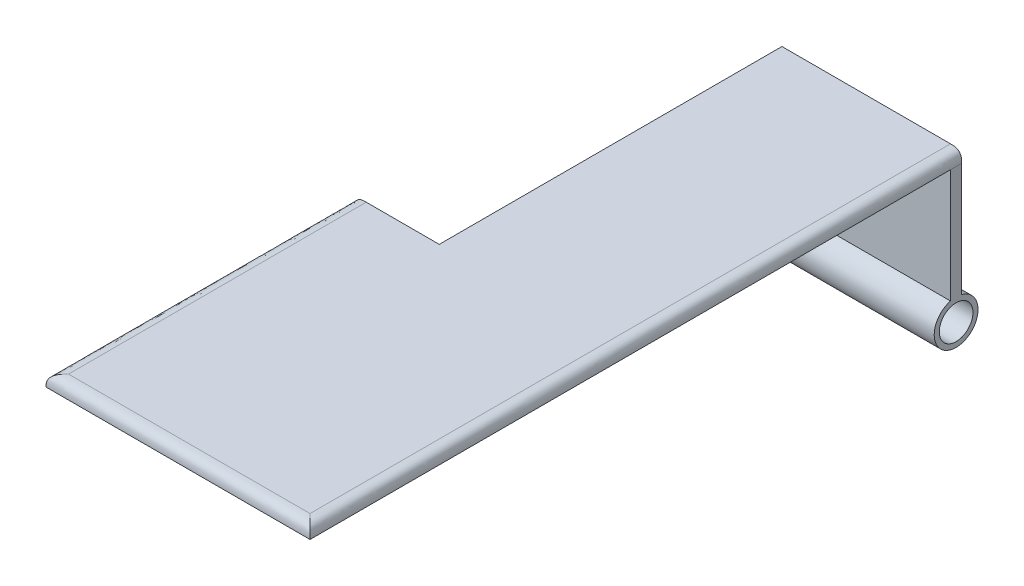
ISO-10303-21;
HEADER;
FILE_DESCRIPTION(('STEP AP214'),'2;1');
FILE_NAME('part.step','',(''),(''),'','','');
FILE_SCHEMA(('AUTOMOTIVE_DESIGN { 1 0 10303 214 1 1 1 1 }'));
ENDSEC;
DATA;
#1=APPLICATION_CONTEXT('core data for automotive mechanical design processes');
#2=APPLICATION_PROTOCOL_DEFINITION('international standard','automotive_design',2000,#1);
#3=PRODUCT_CONTEXT('',#1,'mechanical');
#4=PRODUCT('Part','Part','',(#3));
#5=PRODUCT_RELATED_PRODUCT_CATEGORY('part','',(#4));
#6=PRODUCT_DEFINITION_FORMATION('','',#4);
#7=PRODUCT_DEFINITION_CONTEXT('part definition',#1,'design');
#8=PRODUCT_DEFINITION('design','',#6,#7);
#9=PRODUCT_DEFINITION_SHAPE('','',#8);
#10=(LENGTH_UNIT() NAMED_UNIT(*) SI_UNIT(.MILLI.,.METRE.));
#11=(NAMED_UNIT(*) PLANE_ANGLE_UNIT() SI_UNIT($,.RADIAN.));
#12=(NAMED_UNIT(*) SI_UNIT($,.STERADIAN.) SOLID_ANGLE_UNIT());
#13=UNCERTAINTY_MEASURE_WITH_UNIT(LENGTH_MEASURE(1.E-05),#10,'distance_accuracy_value','');
#14=(GEOMETRIC_REPRESENTATION_CONTEXT(3) GLOBAL_UNCERTAINTY_ASSIGNED_CONTEXT((#13)) GLOBAL_UNIT_ASSIGNED_CONTEXT((#10,
#11,#12)) REPRESENTATION_CONTEXT('',''));
#15=CARTESIAN_POINT('',(0.,0.,0.));
#16=DIRECTION('',(0.,0.,1.));
#17=DIRECTION('',(1.,0.,0.));
#18=AXIS2_PLACEMENT_3D('',#15,#16,#17);
#19=CARTESIAN_POINT('',(-70.6908921558042,0.,0.500534490034143));
#20=DIRECTION('',(0.,0.,-1.));
#21=DIRECTION('',(1.,0.,0.));
#22=AXIS2_PLACEMENT_3D('',#19,#20,#21);
#23=PLANE('',#22);
#24=DIRECTION('',(0.,-1.,0.));
#25=VECTOR('',#24,1.);
#26=CARTESIAN_POINT('',(-70.6908921558042,0.,0.500534490034143));
#27=LINE('',#26,#25);
#28=CARTESIAN_POINT('',(-70.6908921558042,12.,0.500534490034143));
#29=VERTEX_POINT('',#28);
#30=CARTESIAN_POINT('',(-70.6908921558042,1.88466581236204,0.500534490034143));
#31=VERTEX_POINT('',#30);
#32=EDGE_CURVE('E294',#29,#31,#27,.T.);
#33=ORIENTED_EDGE('',*,*,#32,.T.);
#34=DIRECTION('',(1.,0.,0.));
#35=VECTOR('',#34,1.);
#36=CARTESIAN_POINT('',(-70.6908921558042,1.88466581236204,0.500534490034143));
#37=LINE('',#36,#35);
#38=CARTESIAN_POINT('',(-54.6908921558042,1.88466581236204,0.500534490034143));
#39=VERTEX_POINT('',#38);
#40=EDGE_CURVE('E284',#31,#39,#37,.T.);
#41=ORIENTED_EDGE('',*,*,#40,.T.);
#42=DIRECTION('',(0.,-1.,0.));
#43=VECTOR('',#42,1.);
#44=CARTESIAN_POINT('',(-54.6908921558042,0.,0.500534490034143));
#45=LINE('',#44,#43);
#46=CARTESIAN_POINT('',(-54.6908921558042,12.,0.500534490034143));
#47=VERTEX_POINT('',#46);
#48=EDGE_CURVE('E304',#47,#39,#45,.T.);
#49=ORIENTED_EDGE('',*,*,#48,.F.);
#50=DIRECTION('',(1.,0.,0.));
#51=VECTOR('',#50,1.);
#52=CARTESIAN_POINT('',(-70.6908921558042,12.,0.500534490034143));
#53=LINE('',#52,#51);
#54=EDGE_CURVE('E134',#29,#47,#53,.T.);
#55=ORIENTED_EDGE('',*,*,#54,.F.);
#56=EDGE_LOOP('',(#33,#41,#49,#55));
#57=FACE_BOUND('',#56,.T.);
#58=ADVANCED_FACE('F32',(#57),#23,.F.);
#59=CARTESIAN_POINT('',(-70.6908921558042,0.,0.));
#60=DIRECTION('',(1.,0.,0.));
#61=DIRECTION('',(0.,0.,1.));
#62=AXIS2_PLACEMENT_3D('',#59,#60,#61);
#63=CYLINDRICAL_SURFACE('',#62,1.95);
#64=CARTESIAN_POINT('',(-54.6908921558042,0.,0.));
#65=DIRECTION('',(1.,0.,0.));
#66=DIRECTION('',(0.,0.,-1.));
#67=AXIS2_PLACEMENT_3D('',#64,#65,#66);
#68=CIRCLE('',#67,1.95);
#69=CARTESIAN_POINT('',(-54.6908921558042,1.88494939039608,-0.499465509965857));
#70=VERTEX_POINT('',#69);
#71=EDGE_CURVE('E270',#39,#70,#68,.T.);
#72=ORIENTED_EDGE('',*,*,#71,.F.);
#73=ORIENTED_EDGE('',*,*,#40,.F.);
#74=CARTESIAN_POINT('',(-70.6908921558042,0.,0.));
#75=DIRECTION('',(1.,0.,0.));
#76=DIRECTION('',(0.,0.,-1.));
#77=AXIS2_PLACEMENT_3D('',#74,#75,#76);
#78=CIRCLE('',#77,1.95);
#79=CARTESIAN_POINT('',(-70.6908921558042,1.88494939039608,-0.499465509965857));
#80=VERTEX_POINT('',#79);
#81=EDGE_CURVE('E297',#31,#80,#78,.T.);
#82=ORIENTED_EDGE('',*,*,#81,.T.);
#83=DIRECTION('',(1.,0.,0.));
#84=VECTOR('',#83,1.);
#85=CARTESIAN_POINT('',(-70.6908921558042,1.88494939039608,-0.499465509965857));
#86=LINE('',#85,#84);
#87=EDGE_CURVE('E278',#80,#70,#86,.T.);
#88=ORIENTED_EDGE('',*,*,#87,.T.);
#89=EDGE_LOOP('',(#72,#73,#82,#88));
#90=FACE_BOUND('',#89,.T.);
#91=ADVANCED_FACE('F336',(#90),#63,.T.);
#92=CARTESIAN_POINT('',(-70.6908921558042,0.,-0.499465509965857));
#93=DIRECTION('',(0.,0.,-1.));
#94=DIRECTION('',(1.,0.,0.));
#95=AXIS2_PLACEMENT_3D('',#92,#93,#94);
#96=PLANE('',#95);
#97=DIRECTION('',(0.,-1.,0.));
#98=VECTOR('',#97,1.);
#99=CARTESIAN_POINT('',(-54.6908921558042,0.,-0.499465509965857));
#100=LINE('',#99,#98);
#101=CARTESIAN_POINT('',(-54.6908921558042,12.,-0.499465509965857));
#102=VERTEX_POINT('',#101);
#103=EDGE_CURVE('E266',#102,#70,#100,.T.);
#104=ORIENTED_EDGE('',*,*,#103,.T.);
#105=ORIENTED_EDGE('',*,*,#87,.F.);
#106=DIRECTION('',(0.,-1.,0.));
#107=VECTOR('',#106,1.);
#108=CARTESIAN_POINT('',(-70.6908921558042,0.,-0.499465509965857));
#109=LINE('',#108,#107);
#110=CARTESIAN_POINT('',(-70.6908921558042,13.,-0.499465509965857));
#111=VERTEX_POINT('',#110);
#112=EDGE_CURVE('E300',#111,#80,#109,.T.);
#113=ORIENTED_EDGE('',*,*,#112,.F.);
#114=DIRECTION('',(1.,0.,0.));
#115=VECTOR('',#114,1.);
#116=CARTESIAN_POINT('',(-70.6908921558042,13.,-0.499465509965857));
#117=LINE('',#116,#115);
#118=CARTESIAN_POINT('',(-55.6908921558042,13.,-0.499465509965857));
#119=VERTEX_POINT('',#118);
#120=EDGE_CURVE('E281',#111,#119,#117,.T.);
#121=ORIENTED_EDGE('',*,*,#120,.T.);
#122=CARTESIAN_POINT('',(-54.6908921558042,12.,-0.499465509967068));
#123=CARTESIAN_POINT('',(-54.6908921558042,12.1681980515339,-0.499465509967068));
#124=CARTESIAN_POINT('',(-54.6908921558042,12.3363961030679,-0.499465509967068));
#125=CARTESIAN_POINT('',(-54.7625840756403,12.7071067811865,-0.499465509963932));
#126=CARTESIAN_POINT('',(-54.9837853746176,12.9283080801639,-0.499465509963932));
#127=CARTESIAN_POINT('',(-55.3544960527363,13.,-0.499465509967068));
#128=CARTESIAN_POINT('',(-55.5226941042703,13.,-0.499465509967068));
#129=CARTESIAN_POINT('',(-55.6908921558042,13.,-0.499465509967068));
#130=B_SPLINE_CURVE_WITH_KNOTS('',5,(#122,#123,#124,#125,#126,#127,#128,#129),.UNSPECIFIED.,.F.,
.F.,(6,2,6),(0.,0.5,1.),.UNSPECIFIED.);
#131=EDGE_CURVE('E11',#102,#119,#130,.T.);
#132=ORIENTED_EDGE('',*,*,#131,.F.);
#133=EDGE_LOOP('',(#104,#105,#113,#121,#132));
#134=FACE_BOUND('',#133,.T.);
#135=ADVANCED_FACE('F325',(#134),#96,.T.);
#136=CARTESIAN_POINT('',(-70.6908921558042,0.,0.));
#137=DIRECTION('',(1.,0.,0.));
#138=DIRECTION('',(0.,0.,1.));
#139=AXIS2_PLACEMENT_3D('',#136,#137,#138);
#140=CYLINDRICAL_SURFACE('',#139,1.5);
#141=CARTESIAN_POINT('',(-70.6908921558042,0.,0.));
#142=DIRECTION('',(1.,0.,0.));
#143=DIRECTION('',(0.,0.,-1.));
#144=AXIS2_PLACEMENT_3D('',#141,#142,#143);
#145=CIRCLE('',#144,1.5);
#146=CARTESIAN_POINT('',(-70.6908921558042,0.,-1.5));
#147=VERTEX_POINT('',#146);
#148=EDGE_CURVE('E269',#147,#147,#145,.T.);
#149=ORIENTED_EDGE('',*,*,#148,.F.);
#150=EDGE_LOOP('',(#149));
#151=FACE_BOUND('',#150,.T.);
#152=CARTESIAN_POINT('',(-54.6908921558042,0.,0.));
#153=DIRECTION('',(1.,0.,0.));
#154=DIRECTION('',(0.,0.,-1.));
#155=AXIS2_PLACEMENT_3D('',#152,#153,#154);
#156=CIRCLE('',#155,1.5);
#157=CARTESIAN_POINT('',(-54.6908921558042,0.,-1.5));
#158=VERTEX_POINT('',#157);
#159=EDGE_CURVE('E302',#158,#158,#156,.T.);
#160=ORIENTED_EDGE('',*,*,#159,.T.);
#161=EDGE_LOOP('',(#160));
#162=FACE_BOUND('',#161,.T.);
#163=ADVANCED_FACE('F335',(#151,#162),#140,.F.);
#164=CARTESIAN_POINT('',(-70.6908921558042,13.,0.));
#165=DIRECTION('',(0.,1.,0.));
#166=DIRECTION('',(0.,0.,1.));
#167=AXIS2_PLACEMENT_3D('',#164,#165,#166);
#168=PLANE('',#167);
#169=CARTESIAN_POINT('',(-53.5158921558042,13.,56.5));
#170=CARTESIAN_POINT('',(-53.9992254891375,13.,56.5));
#171=CARTESIAN_POINT('',(-57.1131143780264,13.,56.5));
#172=CARTESIAN_POINT('',(-62.6158921558047,13.,56.5000000000001));
#173=CARTESIAN_POINT('',(-70.2658921557703,13.0000000000001,56.5000000000001));
#174=CARTESIAN_POINT('',(-75.7686699335866,13.,56.5));
#175=CARTESIAN_POINT('',(-78.88255882247,13.,56.5));
#176=CARTESIAN_POINT('',(-79.3658921558042,13.,56.5));
#177=B_SPLINE_CURVE_WITH_KNOTS('',3,(#169,#170,#171,#172,#173,#174,#175,#176),.UNSPECIFIED.,.F.,
.F.,(4,1,1,1,1,4),(-0.017175,-0.015725,-0.00783333333333333,-0.000666666666666663,
0.00722500000000001,0.00867500000000001),.UNSPECIFIED.);
#178=CARTESIAN_POINT('',(-55.6908921558042,13.,56.5000000000002));
#179=VERTEX_POINT('',#178);
#180=CARTESIAN_POINT('',(-77.1908921558042,13.,56.5));
#181=VERTEX_POINT('',#180);
#182=EDGE_CURVE('E242',#179,#181,#177,.T.);
#183=ORIENTED_EDGE('',*,*,#182,.F.);
#184=CARTESIAN_POINT('',(-55.6908921558042,13.,-3.39943878546415));
#185=CARTESIAN_POINT('',(-55.6908921558042,13.,9.91154761130566));
#186=CARTESIAN_POINT('',(-55.6908921558042,12.9999999999998,30.3113575704043));
#187=CARTESIAN_POINT('',(-55.6908921558042,13.,51.5778282573921));
#188=CARTESIAN_POINT('',(-55.6908921558042,13.,59.5333125476098));
#189=CARTESIAN_POINT('',(-55.6908921558042,13.,60.3999732754983));
#190=B_SPLINE_CURVE_WITH_KNOTS('',3,(#184,#185,#186,#187,#188,#189),.UNSPECIFIED.,.F.,.F.,(4,1,
1,4),(-0.00339943878546415,0.0365335204048453,0.0577999910918328,0.0603999732754983),.UNSPECIFIED.);
#191=EDGE_CURVE('E112',#119,#179,#190,.T.);
#192=ORIENTED_EDGE('',*,*,#191,.F.);
#193=ORIENTED_EDGE('',*,*,#120,.F.);
#194=DIRECTION('',(0.,0.,-1.));
#195=VECTOR('',#194,1.);
#196=CARTESIAN_POINT('',(-70.6908921558042,13.,0.));
#197=LINE('',#196,#195);
#198=CARTESIAN_POINT('',(-70.6908921558042,13.,30.0005344900341));
#199=VERTEX_POINT('',#198);
#200=EDGE_CURVE('E283',#199,#111,#197,.T.);
#201=ORIENTED_EDGE('',*,*,#200,.F.);
#202=DIRECTION('',(1.,0.,0.));
#203=VECTOR('',#202,1.);
#204=CARTESIAN_POINT('',(-70.6908921558042,13.,30.0005344900341));
#205=LINE('',#204,#203);
#206=CARTESIAN_POINT('',(-77.1908921558042,13.,30.0005344900341));
#207=VERTEX_POINT('',#206);
#208=EDGE_CURVE('E118',#207,#199,#205,.T.);
#209=ORIENTED_EDGE('',*,*,#208,.F.);
#210=CARTESIAN_POINT('',(-77.1908921558042,13.,58.8749732754983));
#211=CARTESIAN_POINT('',(-77.1908921558042,13.,58.3472014364987));
#212=CARTESIAN_POINT('',(-77.1908921558042,13.,54.4583838129476));
#213=CARTESIAN_POINT('',(-77.1908921558044,13.0000000000001,44.3752464592939));
#214=CARTESIAN_POINT('',(-77.1908921558042,13.,34.819880944639));
#215=CARTESIAN_POINT('',(-77.1908921558042,13.,28.6255612145358));
#216=B_SPLINE_CURVE_WITH_KNOTS('',3,(#210,#211,#212,#213,#214,#215),.UNSPECIFIED.,.F.,.F.,(4,1,
1,4),(-0.0588749732754983,-0.0572916577584994,-0.0472085204048453,-0.0286255612145358),.UNSPECIFIED.);
#217=EDGE_CURVE('E377',#181,#207,#216,.T.);
#218=ORIENTED_EDGE('',*,*,#217,.F.);
#219=EDGE_LOOP('',(#183,#192,#193,#201,#209,#218));
#220=FACE_BOUND('',#219,.T.);
#221=ADVANCED_FACE('F337',(#220),#168,.T.);
#222=CARTESIAN_POINT('',(-70.6908921558042,0.,0.));
#223=DIRECTION('',(-1.,0.,0.));
#224=DIRECTION('',(0.,0.,-1.));
#225=AXIS2_PLACEMENT_3D('',#222,#223,#224);
#226=PLANE('',#225);
#227=ORIENTED_EDGE('',*,*,#112,.T.);
#228=ORIENTED_EDGE('',*,*,#81,.F.);
#229=ORIENTED_EDGE('',*,*,#32,.F.);
#230=DIRECTION('',(0.,0.,-1.));
#231=VECTOR('',#230,1.);
#232=CARTESIAN_POINT('',(-70.6908921558042,12.,0.000534490034142989));
#233=LINE('',#232,#231);
#234=CARTESIAN_POINT('',(-70.6908921558042,12.,30.0005344900341));
#235=VERTEX_POINT('',#234);
#236=EDGE_CURVE('E254',#235,#29,#233,.T.);
#237=ORIENTED_EDGE('',*,*,#236,.F.);
#238=DIRECTION('',(0.,1.,0.));
#239=VECTOR('',#238,1.);
#240=CARTESIAN_POINT('',(-70.6908921558042,12.,30.0005344900341));
#241=LINE('',#240,#239);
#242=EDGE_CURVE('E257',#235,#199,#241,.T.);
#243=ORIENTED_EDGE('',*,*,#242,.T.);
#244=ORIENTED_EDGE('',*,*,#200,.T.);
#245=EDGE_LOOP('',(#227,#228,#229,#237,#243,#244));
#246=FACE_BOUND('',#245,.T.);
#247=ORIENTED_EDGE('',*,*,#148,.T.);
#248=EDGE_LOOP('',(#247));
#249=FACE_BOUND('',#248,.T.);
#250=ADVANCED_FACE('F351',(#246,#249),#226,.T.);
#251=CARTESIAN_POINT('',(-54.6908921558042,0.,0.));
#252=DIRECTION('',(-1.,0.,0.));
#253=DIRECTION('',(0.,0.,-1.));
#254=AXIS2_PLACEMENT_3D('',#251,#252,#253);
#255=PLANE('',#254);
#256=ORIENTED_EDGE('',*,*,#48,.T.);
#257=ORIENTED_EDGE('',*,*,#71,.T.);
#258=ORIENTED_EDGE('',*,*,#103,.F.);
#259=CARTESIAN_POINT('',(-54.6908921558042,12.,60.3999732754983));
#260=CARTESIAN_POINT('',(-54.6908921558042,12.,59.5333125476098));
#261=CARTESIAN_POINT('',(-54.6908921558042,12.,51.5778282573921));
#262=CARTESIAN_POINT('',(-54.6908921558042,11.9999999999998,30.3113575704043));
#263=CARTESIAN_POINT('',(-54.6908921558042,12.,9.91154761130566));
#264=CARTESIAN_POINT('',(-54.6908921558042,12.,-3.39943878546415));
#265=B_SPLINE_CURVE_WITH_KNOTS('',3,(#259,#260,#261,#262,#263,#264),.UNSPECIFIED.,.F.,.F.,(4,1,
1,4),(-0.00339943878546415,-0.000799456601798622,0.0204670140851889,0.0603999732754983),.UNSPECIFIED.);
#266=EDGE_CURVE('E46',#47,#102,#265,.T.);
#267=ORIENTED_EDGE('',*,*,#266,.F.);
#268=EDGE_LOOP('',(#256,#257,#258,#267));
#269=FACE_BOUND('',#268,.T.);
#270=ORIENTED_EDGE('',*,*,#159,.F.);
#271=EDGE_LOOP('',(#270));
#272=FACE_BOUND('',#271,.T.);
#273=ADVANCED_FACE('F149',(#269,#272),#255,.F.);
#274=CARTESIAN_POINT('',(-54.6908921558042,12.,0.));
#275=DIRECTION('',(0.,-1.,0.));
#276=DIRECTION('',(0.,0.,-1.));
#277=AXIS2_PLACEMENT_3D('',#274,#275,#276);
#278=PLANE('',#277);
#279=ORIENTED_EDGE('',*,*,#54,.T.);
#280=CARTESIAN_POINT('',(-54.6908921558042,12.,60.3999732754983));
#281=CARTESIAN_POINT('',(-54.6908921558042,12.,59.5333125476098));
#282=CARTESIAN_POINT('',(-54.6908921558042,12.,51.5778282573921));
#283=CARTESIAN_POINT('',(-54.6908921558042,11.9999999999998,30.3113575704043));
#284=CARTESIAN_POINT('',(-54.6908921558042,12.,9.91154761130566));
#285=CARTESIAN_POINT('',(-54.6908921558042,12.,-3.39943878546415));
#286=B_SPLINE_CURVE_WITH_KNOTS('',3,(#280,#281,#282,#283,#284,#285),.UNSPECIFIED.,.F.,.F.,(4,1,
1,4),(-0.00339943878546415,-0.000799456601798622,0.0204670140851889,0.0603999732754983),.UNSPECIFIED.);
#287=CARTESIAN_POINT('',(-54.6908921558042,12.,57.5));
#288=VERTEX_POINT('',#287);
#289=EDGE_CURVE('E110',#47,#288,#286,.F.);
#290=ORIENTED_EDGE('',*,*,#289,.T.);
#291=CARTESIAN_POINT('',(-79.3658921558042,12.,57.5));
#292=CARTESIAN_POINT('',(-78.88255882247,12.,57.5));
#293=CARTESIAN_POINT('',(-75.7686699335866,12.,57.5));
#294=CARTESIAN_POINT('',(-70.2658921557703,12.0000000000001,57.5));
#295=CARTESIAN_POINT('',(-62.6158921558047,12.,57.5));
#296=CARTESIAN_POINT('',(-57.1131143780264,12.,57.5));
#297=CARTESIAN_POINT('',(-53.9992254891375,12.,57.5));
#298=CARTESIAN_POINT('',(-53.5158921558042,12.,57.5));
#299=B_SPLINE_CURVE_WITH_KNOTS('',3,(#291,#292,#293,#294,#295,#296,#297,#298),.UNSPECIFIED.,.F.,
.F.,(4,1,1,1,1,4),(-0.017175,-0.015725,-0.00783333333333332,-0.000666666666666654,
0.00722500000000001,0.00867500000000001),.UNSPECIFIED.);
#300=CARTESIAN_POINT('',(-78.1908921558042,12.,57.5));
#301=VERTEX_POINT('',#300);
#302=EDGE_CURVE('E122',#288,#301,#299,.F.);
#303=ORIENTED_EDGE('',*,*,#302,.T.);
#304=CARTESIAN_POINT('',(-78.1908921558042,12.,28.6255612145358));
#305=CARTESIAN_POINT('',(-78.1908921558042,12.,34.819880944639));
#306=CARTESIAN_POINT('',(-78.1908921558043,12.,44.3752464592939));
#307=CARTESIAN_POINT('',(-78.1908921558042,12.,54.4583838129476));
#308=CARTESIAN_POINT('',(-78.1908921558042,12.,58.3472014364987));
#309=CARTESIAN_POINT('',(-78.1908921558042,12.,58.8749732754983));
#310=B_SPLINE_CURVE_WITH_KNOTS('',3,(#304,#305,#306,#307,#308,#309),.UNSPECIFIED.,.F.,.F.,(4,1,
1,4),(-0.0588749732754983,-0.0402920140851889,-0.0302088767315347,-0.0286255612145358),.UNSPECIFIED.);
#311=CARTESIAN_POINT('',(-78.1908921558042,12.,30.0005344900341));
#312=VERTEX_POINT('',#311);
#313=EDGE_CURVE('E129',#301,#312,#310,.F.);
#314=ORIENTED_EDGE('',*,*,#313,.T.);
#315=DIRECTION('',(1.,0.,0.));
#316=VECTOR('',#315,1.);
#317=CARTESIAN_POINT('',(-70.6908921558042,12.,30.0005344900341));
#318=LINE('',#317,#316);
#319=EDGE_CURVE('E253',#312,#235,#318,.T.);
#320=ORIENTED_EDGE('',*,*,#319,.T.);
#321=ORIENTED_EDGE('',*,*,#236,.T.);
#322=EDGE_LOOP('',(#279,#290,#303,#314,#320,#321));
#323=FACE_BOUND('',#322,.T.);
#324=ADVANCED_FACE('F132',(#323),#278,.T.);
#325=CARTESIAN_POINT('',(-70.6908921558042,12.,30.0005344900341));
#326=DIRECTION('',(0.,0.,-1.));
#327=DIRECTION('',(1.,0.,0.));
#328=AXIS2_PLACEMENT_3D('',#325,#326,#327);
#329=PLANE('',#328);
#330=ORIENTED_EDGE('',*,*,#208,.T.);
#331=ORIENTED_EDGE('',*,*,#242,.F.);
#332=ORIENTED_EDGE('',*,*,#319,.F.);
#333=CARTESIAN_POINT('',(-77.1908921558042,13.,30.0005344900344));
#334=CARTESIAN_POINT('',(-77.3590902073381,13.,30.0005344900344));
#335=CARTESIAN_POINT('',(-77.5272882588721,13.,30.0005344900344));
#336=CARTESIAN_POINT('',(-77.8979989369907,12.9283080801639,30.0005344900337));
#337=CARTESIAN_POINT('',(-78.1192002359681,12.7071067811865,30.0005344900337));
#338=CARTESIAN_POINT('',(-78.1908921558042,12.3363961030679,30.0005344900344));
#339=CARTESIAN_POINT('',(-78.1908921558042,12.1681980515339,30.0005344900344));
#340=CARTESIAN_POINT('',(-78.1908921558042,12.,30.0005344900344));
#341=B_SPLINE_CURVE_WITH_KNOTS('',5,(#333,#334,#335,#336,#337,#338,#339,#340),.UNSPECIFIED.,.F.,
.F.,(6,2,6),(0.,0.5,1.),.UNSPECIFIED.);
#342=EDGE_CURVE('E250',#207,#312,#341,.T.);
#343=ORIENTED_EDGE('',*,*,#342,.F.);
#344=EDGE_LOOP('',(#330,#331,#332,#343));
#345=FACE_BOUND('',#344,.T.);
#346=ADVANCED_FACE('F148',(#345),#329,.T.);
#347=CARTESIAN_POINT('',(-55.6908921558042,13.,-3.39943878546415));
#348=CARTESIAN_POINT('',(-55.6908921558042,13.,9.91154761130566));
#349=CARTESIAN_POINT('',(-55.6908921558042,12.9999999999998,30.3113575704043));
#350=CARTESIAN_POINT('',(-55.6908921558042,13.,51.5778282573921));
#351=CARTESIAN_POINT('',(-55.6908921558042,13.,59.5333125476098));
#352=CARTESIAN_POINT('',(-55.6908921558042,13.,60.3999732754983));
#353=CARTESIAN_POINT('',(-55.5226941042703,13.,-3.39943878546415));
#354=CARTESIAN_POINT('',(-55.5226941042703,13.,9.91154761130566));
#355=CARTESIAN_POINT('',(-55.5226941042702,12.9999999999998,30.3113575704043));
#356=CARTESIAN_POINT('',(-55.5226941042703,13.,51.5778282573921));
#357=CARTESIAN_POINT('',(-55.5226941042703,13.,59.5333125476098));
#358=CARTESIAN_POINT('',(-55.5226941042703,13.,60.3999732754983));
#359=CARTESIAN_POINT('',(-55.3544960527363,13.,-3.39943878546415));
#360=CARTESIAN_POINT('',(-55.3544960527363,13.,9.91154761130566));
#361=CARTESIAN_POINT('',(-55.3544960527363,12.9999999999998,30.3113575704043));
#362=CARTESIAN_POINT('',(-55.3544960527363,13.,51.5778282573921));
#363=CARTESIAN_POINT('',(-55.3544960527363,13.,59.5333125476098));
#364=CARTESIAN_POINT('',(-55.3544960527363,13.,60.3999732754983));
#365=CARTESIAN_POINT('',(-54.9837853746176,12.9283080801639,-3.39943878546415));
#366=CARTESIAN_POINT('',(-54.9837853746176,12.9283080801639,9.91154761130566));
#367=CARTESIAN_POINT('',(-54.9837853746176,12.9283080801639,30.3113575707254));
#368=CARTESIAN_POINT('',(-54.9837853746176,12.9283080801639,51.5778282574143));
#369=CARTESIAN_POINT('',(-54.9837853746176,12.9283080801639,59.5333125475918));
#370=CARTESIAN_POINT('',(-54.9837853746176,12.9283080801639,60.3999732754983));
#371=CARTESIAN_POINT('',(-54.7625840756403,12.7071067811865,-3.39943878546415));
#372=CARTESIAN_POINT('',(-54.7625840756403,12.7071067811865,9.91154761130566));
#373=CARTESIAN_POINT('',(-54.7625840756403,12.7071067811864,30.3113575707254));
#374=CARTESIAN_POINT('',(-54.7625840756403,12.7071067811866,51.5778282574143));
#375=CARTESIAN_POINT('',(-54.7625840756403,12.7071067811865,59.5333125475918));
#376=CARTESIAN_POINT('',(-54.7625840756403,12.7071067811865,60.3999732754983));
#377=CARTESIAN_POINT('',(-54.6908921558042,12.3363961030679,-3.39943878546415));
#378=CARTESIAN_POINT('',(-54.6908921558042,12.3363961030679,9.91154761130566));
#379=CARTESIAN_POINT('',(-54.6908921558042,12.3363961030676,30.3113575704043));
#380=CARTESIAN_POINT('',(-54.6908921558042,12.3363961030679,51.5778282573921));
#381=CARTESIAN_POINT('',(-54.6908921558042,12.3363961030679,59.5333125476098));
#382=CARTESIAN_POINT('',(-54.6908921558042,12.3363961030679,60.3999732754983));
#383=CARTESIAN_POINT('',(-54.6908921558042,12.1681980515339,-3.39943878546415));
#384=CARTESIAN_POINT('',(-54.6908921558042,12.1681980515339,9.91154761130566));
#385=CARTESIAN_POINT('',(-54.6908921558042,12.1681980515338,30.3113575704043));
#386=CARTESIAN_POINT('',(-54.6908921558042,12.168198051534,51.5778282573921));
#387=CARTESIAN_POINT('',(-54.6908921558042,12.1681980515339,59.5333125476098));
#388=CARTESIAN_POINT('',(-54.6908921558042,12.1681980515339,60.3999732754983));
#389=CARTESIAN_POINT('',(-54.6908921558042,12.,-3.39943878546415));
#390=CARTESIAN_POINT('',(-54.6908921558042,12.,9.91154761130566));
#391=CARTESIAN_POINT('',(-54.6908921558042,11.9999999999998,30.3113575704043));
#392=CARTESIAN_POINT('',(-54.6908921558042,12.,51.5778282573921));
#393=CARTESIAN_POINT('',(-54.6908921558042,12.,59.5333125476098));
#394=CARTESIAN_POINT('',(-54.6908921558042,12.,60.3999732754983));
#395=B_SPLINE_SURFACE_WITH_KNOTS('',5,3,((#347,#348,#349,#350,#351,#352),(#353,#354,#355,#356,
#357,#358),(#359,#360,#361,#362,#363,#364),(#365,#366,#367,#368,#369,#370),(#371,#372,#373,#374,
#375,#376),(#377,#378,#379,#380,#381,#382),(#383,#384,#385,#386,#387,#388),(#389,#390,#391,#392,
#393,#394)),.UNSPECIFIED.,.F.,.F.,.F.,(6,2,6),(4,1,1,4),(0.,0.5,1.),(-0.00339943878546415,
0.0365335204048453,0.0577999910918328,0.0603999732754983),.UNSPECIFIED.);
#396=CARTESIAN_POINT('',(-55.6908921558042,13.,56.5));
#397=CARTESIAN_POINT('',(-55.6614866639176,13.0000295344226,56.5298455522407));
#398=CARTESIAN_POINT('',(-55.6320056684098,13.000000737052,56.5596307203183));
#399=CARTESIAN_POINT('',(-55.5728341348375,12.9992098867897,56.6191417628274));
#400=CARTESIAN_POINT('',(-55.5431432444559,12.9984458325546,56.6488672534709));
#401=CARTESIAN_POINT('',(-55.4835668547691,12.9955567416339,56.7082442773162));
#402=CARTESIAN_POINT('',(-55.4536810400456,12.9934277167095,56.7378953373292));
#403=CARTESIAN_POINT('',(-55.4089098174665,12.9888734759745,56.7823149268031));
#404=CARTESIAN_POINT('',(-55.3939891191354,12.9871275456562,56.7971184459024));
#405=CARTESIAN_POINT('',(-55.364232230131,12.9831374260701,56.8267246563983));
#406=CARTESIAN_POINT('',(-55.3493959915742,12.9808935557151,56.8415273422859));
#407=CARTESIAN_POINT('',(-55.315952644828,12.9752010599451,56.8749002930276));
#408=CARTESIAN_POINT('',(-55.2973597078175,12.9715909748372,56.8934577692917));
#409=CARTESIAN_POINT('',(-55.2613302479619,12.9636090244681,56.929329782707));
#410=CARTESIAN_POINT('',(-55.243890013201,12.9592944349988,56.9466532421564));
#411=CARTESIAN_POINT('',(-55.21025903698,12.9499845252293,56.9800819832594));
#412=CARTESIAN_POINT('',(-55.1940591927385,12.9450497226357,56.9961948514535));
#413=CARTESIAN_POINT('',(-55.162944182401,12.9345913312802,57.0271959401053));
#414=CARTESIAN_POINT('',(-55.1480166368397,12.9291306952036,57.0420928564399));
#415=CARTESIAN_POINT('',(-55.1194594839998,12.9177229366496,57.0706621282349));
#416=CARTESIAN_POINT('',(-55.1058145018388,12.9118401729605,57.0843446789205));
#417=CARTESIAN_POINT('',(-55.0798078311472,12.8996946930307,57.1104823236487));
#418=CARTESIAN_POINT('',(-55.0674287734816,12.8934969594745,57.1229502241296));
#419=CARTESIAN_POINT('',(-55.0439155935336,12.8808280728156,57.1466556594059));
#420=CARTESIAN_POINT('',(-55.0327632311872,12.8744220038882,57.1579096198304));
#421=CARTESIAN_POINT('',(-55.0165647022062,12.8644636854973,57.1742305788143));
#422=CARTESIAN_POINT('',(-55.0114334088005,12.8612110771747,57.1793968838335));
#423=CARTESIAN_POINT('',(-55.0014561560044,12.8546836367098,57.1894201902099));
#424=CARTESIAN_POINT('',(-54.9966080667418,12.8514169434622,57.1942803649389));
#425=CARTESIAN_POINT('',(-54.984483282208,12.8429946525911,57.2064145110656));
#426=CARTESIAN_POINT('',(-54.9772385437629,12.8377308687842,57.2136457269465));
#427=CARTESIAN_POINT('',(-54.9630241031687,12.8269061265417,57.2278284932648));
#428=CARTESIAN_POINT('',(-54.9560518015452,12.8213521047932,57.2347827296405));
#429=CARTESIAN_POINT('',(-54.9423867615236,12.8099441033597,57.2484076064258));
#430=CARTESIAN_POINT('',(-54.9356912917719,12.8040967582296,57.2550810513017));
#431=CARTESIAN_POINT('',(-54.9225855353968,12.7921021529979,57.2681453269061));
#432=CARTESIAN_POINT('',(-54.9161724244892,12.7859610253603,57.2745389470828));
#433=CARTESIAN_POINT('',(-54.9036332947317,12.7733786078538,57.2870431204191));
#434=CARTESIAN_POINT('',(-54.8975044947401,12.7669428076364,57.2931564015752));
#435=CARTESIAN_POINT('',(-54.8855346108657,12.7537727303542,57.3050998744951));
#436=CARTESIAN_POINT('',(-54.8796908825619,12.7470432089997,57.3109326550941));
#437=CARTESIAN_POINT('',(-54.8682914727199,12.7332900889513,57.3223152835205));
#438=CARTESIAN_POINT('',(-54.8627333425335,12.7262705041108,57.327867525456));
#439=CARTESIAN_POINT('',(-54.8519051956661,12.711944138214,57.3386892772603));
#440=CARTESIAN_POINT('',(-54.8466329690101,12.7046406607024,57.3439609472446));
#441=CARTESIAN_POINT('',(-54.8363763821466,12.6897556316973,57.3542217968824));
#442=CARTESIAN_POINT('',(-54.8313900770028,12.6821767324732,57.3592128790401));
#443=CARTESIAN_POINT('',(-54.8217047280563,12.6667519791339,57.3689128248512));
#444=CARTESIAN_POINT('',(-54.8170040133839,12.6589082040648,57.3736233260642));
#445=CARTESIAN_POINT('',(-54.8078888331272,12.6429665686193,57.382762361383));
#446=CARTESIAN_POINT('',(-54.8034729635034,12.634870302368,57.3871922762064));
#447=CARTESIAN_POINT('',(-54.7949260169357,12.6184381093052,57.3957704819238));
#448=CARTESIAN_POINT('',(-54.7907937817154,12.610103381981,57.3999199170045));
#449=CARTESIAN_POINT('',(-54.7828121107814,12.5932098891183,57.4079371112422));
#450=CARTESIAN_POINT('',(-54.7789617313566,12.5846520148597,57.4118058099449));
#451=CARTESIAN_POINT('',(-54.771541337784,12.567329316819,57.4192628339866));
#452=CARTESIAN_POINT('',(-54.7679705563997,12.55856515183,57.4228519264364));
#453=CARTESIAN_POINT('',(-54.7611058587273,12.540846385133,57.4297458547934));
#454=CARTESIAN_POINT('',(-54.7578113125604,12.5318922784303,57.4330513378191));
#455=CARTESIAN_POINT('',(-54.751496550328,12.5138161182137,57.4393932682906));
#456=CARTESIAN_POINT('',(-54.7484757988239,12.504694436376,57.4424302405432));
#457=CARTESIAN_POINT('',(-54.7432593090823,12.4880711077273,57.447621678035));
#458=CARTESIAN_POINT('',(-54.7410177510349,12.4806014666931,57.4498325855062));
#459=CARTESIAN_POINT('',(-54.7366143756894,12.4652503728169,57.4541117464435));
#460=CARTESIAN_POINT('',(-54.7344593370572,12.4573644007522,57.456170753161));
#461=CARTESIAN_POINT('',(-54.7302488815897,12.4411841797218,57.4601574913632));
#462=CARTESIAN_POINT('',(-54.7282006638851,12.4328860304974,57.4620769320477));
#463=CARTESIAN_POINT('',(-54.7242218620231,12.415883036475,57.4657807055934));
#464=CARTESIAN_POINT('',(-54.7222987201094,12.4071747317088,57.4675571177339));
#465=CARTESIAN_POINT('',(-54.7185875564278,12.3893567080487,57.4709752900975));
#466=CARTESIAN_POINT('',(-54.7168071097232,12.3802440087314,57.4726096911242));
#467=CARTESIAN_POINT('',(-54.7133973510991,12.3616246245222,57.4757430469141));
#468=CARTESIAN_POINT('',(-54.7117756167037,12.35211540874,57.4772351621857));
#469=CARTESIAN_POINT('',(-54.7086974666495,12.3327128158348,57.4800835560905));
#470=CARTESIAN_POINT('',(-54.7072485091904,12.3228173344442,57.4814335235617));
#471=CARTESIAN_POINT('',(-54.7045274632142,12.302654388069,57.4839969221831));
#472=CARTESIAN_POINT('',(-54.7032625901906,12.2923852229317,57.4852045422941));
#473=CARTESIAN_POINT('',(-54.6996943535463,12.2605751755267,57.4886735032148));
#474=CARTESIAN_POINT('',(-54.697763583169,12.2389602500336,57.4906470164944));
#475=CARTESIAN_POINT('',(-54.6946352913239,12.1944189728229,57.4940634916158));
#476=CARTESIAN_POINT('',(-54.6934847617956,12.1714868200433,57.4954706524941));
#477=CARTESIAN_POINT('',(-54.6918422495654,12.1244031065731,57.4977494018384));
#478=CARTESIAN_POINT('',(-54.6913868341363,12.1002489865335,57.4985900258383));
#479=CARTESIAN_POINT('',(-54.6908917912888,12.0507272942204,57.4997282797545));
#480=CARTESIAN_POINT('',(-54.6908738294119,12.0253587584169,57.4999970149955));
#481=CARTESIAN_POINT('',(-54.6908921558042,12.,57.5));
#482=B_SPLINE_CURVE_WITH_KNOTS('',3,(#396,#397,#398,#399,#400,#401,#402,#403,#404,#405,#406,
#407,#408,#409,#410,#411,#412,#413,#414,#415,#416,#417,#418,#419,#420,#421,#422,#423,#424,#425,
#426,#427,#428,#429,#430,#431,#432,#433,#434,#435,#436,#437,#438,#439,#440,#441,#442,#443,#444,
#445,#446,#447,#448,#449,#450,#451,#452,#453,#454,#455,#456,#457,#458,#459,#460,#461,#462,#463,
#464,#465,#466,#467,#468,#469,#470,#471,#472,#473,#474,#475,#476,#477,#478,#479,#480,#481),
.UNSPECIFIED.,.F.,.F.,(4,2,2,2,2,2,2,2,2,2,2,2,2,2,2,2,2,2,2,2,2,2,2,2,2,2,2,2,2,2,2,2,2,2,2,2,
2,2,2,2,2,2,4),(0.,0.12571003520365,0.251763219436147,0.378186401083347,0.441453591977749,
0.504680378859682,0.584211472132784,0.659066038836367,0.729173812776938,0.794508878946426,
0.855087446219614,0.910961660995094,0.962211452774959,0.986134366830721,1.00893953342473,
1.04346132805895,1.07737011717773,1.11070730989129,1.14352231668422,1.17587210770597,
1.20781617813536,1.23941141514111,1.27071089015297,1.30176312516797,1.33261151559056,
1.36329393137907,1.39384250652752,1.42428361608315,1.45463803088741,1.48492123353762,
1.51514387481231,1.53945659785943,1.56474206847203,1.59101707524245,1.61829192983886,
1.64657032617737,1.67584938678252,1.70611996294295,1.73736726498033,1.80270595723659,
1.87169501939651,1.94420153296186,2.02029210837318),.UNSPECIFIED.);
#483=EDGE_CURVE('E106',#179,#288,#482,.T.);
#484=ORIENTED_EDGE('',*,*,#266,.T.);
#485=ORIENTED_EDGE('',*,*,#131,.T.);
#486=ORIENTED_EDGE('',*,*,#191,.T.);
#487=ORIENTED_EDGE('',*,*,#483,.T.);
#488=ORIENTED_EDGE('',*,*,#289,.F.);
#489=EDGE_LOOP('',(#484,#485,#486,#487,#488));
#490=FACE_BOUND('',#489,.T.);
#491=ADVANCED_FACE('F34',(#490),#395,.F.);
#492=CARTESIAN_POINT('',(-53.5158921558042,13.,56.5));
#493=CARTESIAN_POINT('',(-53.9992254891375,13.,56.5));
#494=CARTESIAN_POINT('',(-57.1131143780264,13.,56.5));
#495=CARTESIAN_POINT('',(-62.6158921558047,13.,56.5000000000001));
#496=CARTESIAN_POINT('',(-70.2658921557703,13.0000000000001,56.5000000000001));
#497=CARTESIAN_POINT('',(-75.7686699335866,13.,56.5));
#498=CARTESIAN_POINT('',(-78.88255882247,13.,56.5));
#499=CARTESIAN_POINT('',(-79.3658921558042,13.,56.5));
#500=CARTESIAN_POINT('',(-53.5158921558042,13.,56.6681980515339));
#501=CARTESIAN_POINT('',(-53.9992254891375,13.,56.6681980515339));
#502=CARTESIAN_POINT('',(-57.1131143780264,13.,56.668198051534));
#503=CARTESIAN_POINT('',(-62.6158921558047,13.,56.6681980515339));
#504=CARTESIAN_POINT('',(-70.2658921557703,13.0000000000001,56.6681980515344));
#505=CARTESIAN_POINT('',(-75.7686699335866,13.,56.6681980515339));
#506=CARTESIAN_POINT('',(-78.88255882247,13.,56.668198051534));
#507=CARTESIAN_POINT('',(-79.3658921558042,13.,56.668198051534));
#508=CARTESIAN_POINT('',(-53.5158921558042,13.,56.8363961030679));
#509=CARTESIAN_POINT('',(-53.9992254891375,13.,56.8363961030679));
#510=CARTESIAN_POINT('',(-57.1131143780264,13.,56.8363961030679));
#511=CARTESIAN_POINT('',(-62.6158921558047,13.,56.8363961030679));
#512=CARTESIAN_POINT('',(-70.2658921557703,13.0000000000001,56.8363961030678));
#513=CARTESIAN_POINT('',(-75.7686699335866,13.,56.8363961030679));
#514=CARTESIAN_POINT('',(-78.88255882247,13.,56.8363961030679));
#515=CARTESIAN_POINT('',(-79.3658921558042,13.,56.8363961030679));
#516=CARTESIAN_POINT('',(-53.5158921558042,12.9283080801639,57.2071067811866));
#517=CARTESIAN_POINT('',(-53.9992254891375,12.9283080801639,57.2071067811866));
#518=CARTESIAN_POINT('',(-57.1131143780264,12.9283080801639,57.2071067811866));
#519=CARTESIAN_POINT('',(-62.6158921558047,12.9283080801639,57.2071067811865));
#520=CARTESIAN_POINT('',(-70.2658921557703,12.928308080164,57.2071067811866));
#521=CARTESIAN_POINT('',(-75.7686699335866,12.9283080801639,57.2071067811865));
#522=CARTESIAN_POINT('',(-78.88255882247,12.9283080801639,57.2071067811866));
#523=CARTESIAN_POINT('',(-79.3658921558042,12.9283080801639,57.2071067811866));
#524=CARTESIAN_POINT('',(-53.5158921558042,12.7071067811865,57.4283080801639));
#525=CARTESIAN_POINT('',(-53.9992254891375,12.7071067811865,57.4283080801639));
#526=CARTESIAN_POINT('',(-57.1131143780264,12.7071067811865,57.4283080801639));
#527=CARTESIAN_POINT('',(-62.6158921558047,12.7071067811865,57.428308080164));
#528=CARTESIAN_POINT('',(-70.2658921557703,12.7071067811866,57.4283080801639));
#529=CARTESIAN_POINT('',(-75.7686699335866,12.7071067811865,57.4283080801639));
#530=CARTESIAN_POINT('',(-78.88255882247,12.7071067811865,57.4283080801639));
#531=CARTESIAN_POINT('',(-79.3658921558042,12.7071067811865,57.4283080801639));
#532=CARTESIAN_POINT('',(-53.5158921558042,12.3363961030679,57.5));
#533=CARTESIAN_POINT('',(-53.9992254891375,12.3363961030679,57.5));
#534=CARTESIAN_POINT('',(-57.1131143780264,12.3363961030679,57.5));
#535=CARTESIAN_POINT('',(-62.6158921558047,12.3363961030679,57.5));
#536=CARTESIAN_POINT('',(-70.2658921557703,12.336396103068,57.5));
#537=CARTESIAN_POINT('',(-75.7686699335866,12.3363961030679,57.5));
#538=CARTESIAN_POINT('',(-78.88255882247,12.3363961030679,57.5));
#539=CARTESIAN_POINT('',(-79.3658921558042,12.3363961030679,57.5));
#540=CARTESIAN_POINT('',(-53.5158921558042,12.1681980515339,57.5));
#541=CARTESIAN_POINT('',(-53.9992254891375,12.1681980515339,57.5));
#542=CARTESIAN_POINT('',(-57.1131143780264,12.1681980515339,57.5));
#543=CARTESIAN_POINT('',(-62.6158921558047,12.1681980515339,57.5));
#544=CARTESIAN_POINT('',(-70.2658921557703,12.168198051534,57.5));
#545=CARTESIAN_POINT('',(-75.7686699335866,12.1681980515339,57.5));
#546=CARTESIAN_POINT('',(-78.88255882247,12.1681980515339,57.5));
#547=CARTESIAN_POINT('',(-79.3658921558042,12.1681980515339,57.5));
#548=CARTESIAN_POINT('',(-53.5158921558042,12.,57.5));
#549=CARTESIAN_POINT('',(-53.9992254891375,12.,57.5));
#550=CARTESIAN_POINT('',(-57.1131143780264,12.,57.5));
#551=CARTESIAN_POINT('',(-62.6158921558047,12.,57.5));
#552=CARTESIAN_POINT('',(-70.2658921557703,12.0000000000001,57.5));
#553=CARTESIAN_POINT('',(-75.7686699335866,12.,57.5));
#554=CARTESIAN_POINT('',(-78.88255882247,12.,57.5));
#555=CARTESIAN_POINT('',(-79.3658921558042,12.,57.5));
#556=B_SPLINE_SURFACE_WITH_KNOTS('',5,3,((#492,#493,#494,#495,#496,#497,#498,#499),(#500,#501,
#502,#503,#504,#505,#506,#507),(#508,#509,#510,#511,#512,#513,#514,#515),(#516,#517,#518,#519,
#520,#521,#522,#523),(#524,#525,#526,#527,#528,#529,#530,#531),(#532,#533,#534,#535,#536,#537,
#538,#539),(#540,#541,#542,#543,#544,#545,#546,#547),(#548,#549,#550,#551,#552,#553,#554,#555)),
.UNSPECIFIED.,.F.,.F.,.F.,(6,2,6),(4,1,1,1,1,4),(0.,0.5,1.),(-0.017175,-0.015725,
-0.00783333333333333,-0.000666666666666663,0.00722500000000001,0.00867500000000001),.UNSPECIFIED.);
#557=CARTESIAN_POINT('',(-77.1908921558042,13.,56.5));
#558=CARTESIAN_POINT('',(-77.220737708045,13.0000295344226,56.5294054918866));
#559=CARTESIAN_POINT('',(-77.2505228761226,13.000000737052,56.5588864873944));
#560=CARTESIAN_POINT('',(-77.3100339186318,12.9992098867897,56.6180580209668));
#561=CARTESIAN_POINT('',(-77.3397594092753,12.9984458325546,56.6477489113484));
#562=CARTESIAN_POINT('',(-77.3991364331206,12.9955567416339,56.7073253010353));
#563=CARTESIAN_POINT('',(-77.4287874931336,12.9934277167094,56.7372111157588));
#564=CARTESIAN_POINT('',(-77.4732070826076,12.9888734759745,56.7819823383379));
#565=CARTESIAN_POINT('',(-77.4880106017069,12.9871275456562,56.796903036669));
#566=CARTESIAN_POINT('',(-77.5176168122027,12.9831374260701,56.8266599256735));
#567=CARTESIAN_POINT('',(-77.5324194980903,12.9808935557151,56.8414961642302));
#568=CARTESIAN_POINT('',(-77.5657924488318,12.9752010599451,56.8749395109762));
#569=CARTESIAN_POINT('',(-77.5843499250958,12.9715909748372,56.8935324479865));
#570=CARTESIAN_POINT('',(-77.6202219385107,12.9636090244683,56.9295619078418));
#571=CARTESIAN_POINT('',(-77.6375453979599,12.9592944349989,56.9470021426025));
#572=CARTESIAN_POINT('',(-77.6709741390628,12.9499845252295,56.9806331188233));
#573=CARTESIAN_POINT('',(-77.6870870072567,12.945049722636,56.9968329630647));
#574=CARTESIAN_POINT('',(-77.7180880959085,12.9345913312806,57.0279479734021));
#575=CARTESIAN_POINT('',(-77.7329850122431,12.929130695204,57.0428755189634));
#576=CARTESIAN_POINT('',(-77.7615542840381,12.91772293665,57.0714326718033));
#577=CARTESIAN_POINT('',(-77.7752368347237,12.9118401729609,57.0850776539643));
#578=CARTESIAN_POINT('',(-77.801374479452,12.8996946930312,57.111084324656));
#579=CARTESIAN_POINT('',(-77.813842379933,12.8934969594749,57.1234633823218));
#580=CARTESIAN_POINT('',(-77.8375478152095,12.8808280728159,57.14697656227));
#581=CARTESIAN_POINT('',(-77.8488017756342,12.8744220038885,57.1581289246165));
#582=CARTESIAN_POINT('',(-77.8651227346183,12.8644636854975,57.1743274535978));
#583=CARTESIAN_POINT('',(-77.8702890396375,12.8612110771748,57.1794587470036));
#584=CARTESIAN_POINT('',(-77.8803123460141,12.8546836367098,57.1894359997998));
#585=CARTESIAN_POINT('',(-77.8851725207432,12.8514169434622,57.1942840890624));
#586=CARTESIAN_POINT('',(-77.8973066668701,12.842994652591,57.2064088735963));
#587=CARTESIAN_POINT('',(-77.9045378827509,12.837730868784,57.2136536120415));
#588=CARTESIAN_POINT('',(-77.9187206490693,12.8269061265415,57.2278680526357));
#589=CARTESIAN_POINT('',(-77.925674885445,12.821352104793,57.2348403542592));
#590=CARTESIAN_POINT('',(-77.9392997622304,12.8099441033595,57.2485053942809));
#591=CARTESIAN_POINT('',(-77.9459732071063,12.8040967582293,57.2552008640326));
#592=CARTESIAN_POINT('',(-77.9590374827107,12.7921021529976,57.2683066204077));
#593=CARTESIAN_POINT('',(-77.9654311028874,12.78596102536,57.2747197313153));
#594=CARTESIAN_POINT('',(-77.9779352762237,12.7733786078535,57.2872588610728));
#595=CARTESIAN_POINT('',(-77.9840485573798,12.766942807636,57.2933876610645));
#596=CARTESIAN_POINT('',(-77.9959920302997,12.7537727303538,57.3053575449389));
#597=CARTESIAN_POINT('',(-78.0018248108988,12.7470432089993,57.3112012732426));
#598=CARTESIAN_POINT('',(-78.0132074393252,12.7332900889509,57.3226006830846));
#599=CARTESIAN_POINT('',(-78.0187596812606,12.7262705041103,57.328158813271));
#600=CARTESIAN_POINT('',(-78.029581433065,12.7119441382135,57.3389869601384));
#601=CARTESIAN_POINT('',(-78.0348531030492,12.704640660702,57.3442591867944));
#602=CARTESIAN_POINT('',(-78.0451139526871,12.6897556316969,57.3545157736579));
#603=CARTESIAN_POINT('',(-78.0501050348448,12.6821767324728,57.3595020788017));
#604=CARTESIAN_POINT('',(-78.0598049806558,12.6667519791334,57.3691874277482));
#605=CARTESIAN_POINT('',(-78.0645154818688,12.6589082040644,57.3738881424205));
#606=CARTESIAN_POINT('',(-78.0736545171876,12.6429665686188,57.3830033226773));
#607=CARTESIAN_POINT('',(-78.078084432011,12.6348703023675,57.3874191923011));
#608=CARTESIAN_POINT('',(-78.0866626377284,12.6184381093048,57.3959661388687));
#609=CARTESIAN_POINT('',(-78.090812072809,12.6101033819806,57.4000983740889));
#610=CARTESIAN_POINT('',(-78.0988292670467,12.5932098891179,57.4080800450229));
#611=CARTESIAN_POINT('',(-78.1026979657494,12.5846520148594,57.4119304244478));
#612=CARTESIAN_POINT('',(-78.1101549897909,12.5673293168187,57.4193508180204));
#613=CARTESIAN_POINT('',(-78.1137440822408,12.5585651518297,57.4229215994047));
#614=CARTESIAN_POINT('',(-78.1206380105977,12.5408463851327,57.429786297077));
#615=CARTESIAN_POINT('',(-78.1239434936234,12.53189227843,57.4330808432439));
#616=CARTESIAN_POINT('',(-78.1302854240949,12.5138161182135,57.4393956054763));
#617=CARTESIAN_POINT('',(-78.1333223963475,12.5046944363759,57.4424163569804));
#618=CARTESIAN_POINT('',(-78.1385138338393,12.488071107727,57.447632846722));
#619=CARTESIAN_POINT('',(-78.1407247413105,12.4806014666928,57.4498744047694));
#620=CARTESIAN_POINT('',(-78.1450039022479,12.4652503728163,57.4542777801149));
#621=CARTESIAN_POINT('',(-78.1470629089654,12.4573644007515,57.4564328187472));
#622=CARTESIAN_POINT('',(-78.1510496471676,12.4411841797209,57.4606432742147));
#623=CARTESIAN_POINT('',(-78.1529690878522,12.4328860304965,57.4626914919194));
#624=CARTESIAN_POINT('',(-78.1566728613979,12.4158830364739,57.4666702937814));
#625=CARTESIAN_POINT('',(-78.1584492735383,12.4071747317076,57.4685934356951));
#626=CARTESIAN_POINT('',(-78.161867445902,12.3893567080473,57.4723045993766));
#627=CARTESIAN_POINT('',(-78.1635018469287,12.38024400873,57.4740850460813));
#628=CARTESIAN_POINT('',(-78.1666352027185,12.3616246245207,57.4774948047053));
#629=CARTESIAN_POINT('',(-78.1681273179901,12.3521154087385,57.4791165391008));
#630=CARTESIAN_POINT('',(-78.170975711895,12.3327128158332,57.4821946891549));
#631=CARTESIAN_POINT('',(-78.1723256793661,12.3228173344426,57.4836436466141));
#632=CARTESIAN_POINT('',(-78.1748890779874,12.3026543880673,57.4863646925902));
#633=CARTESIAN_POINT('',(-78.1760966980984,12.29238522293,57.4876295656138));
#634=CARTESIAN_POINT('',(-78.1795656590191,12.260575175525,57.491197802258));
#635=CARTESIAN_POINT('',(-78.1815391722987,12.238960250032,57.4931285726353));
#636=CARTESIAN_POINT('',(-78.18495564742,12.1944189728214,57.4962568644804));
#637=CARTESIAN_POINT('',(-78.1863628082983,12.1714868200419,57.4974073940086));
#638=CARTESIAN_POINT('',(-78.1886415576426,12.1244031065721,57.4990499062388));
#639=CARTESIAN_POINT('',(-78.1894821816424,12.1002489865326,57.4995053216679));
#640=CARTESIAN_POINT('',(-78.1906204355586,12.0507272942199,57.5000003645154));
#641=CARTESIAN_POINT('',(-78.1908891707996,12.0253587584167,57.5000183263923));
#642=CARTESIAN_POINT('',(-78.1908921558042,12.,57.5));
#643=B_SPLINE_CURVE_WITH_KNOTS('',3,(#557,#558,#559,#560,#561,#562,#563,#564,#565,#566,#567,
#568,#569,#570,#571,#572,#573,#574,#575,#576,#577,#578,#579,#580,#581,#582,#583,#584,#585,#586,
#587,#588,#589,#590,#591,#592,#593,#594,#595,#596,#597,#598,#599,#600,#601,#602,#603,#604,#605,
#606,#607,#608,#609,#610,#611,#612,#613,#614,#615,#616,#617,#618,#619,#620,#621,#622,#623,#624,
#625,#626,#627,#628,#629,#630,#631,#632,#633,#634,#635,#636,#637,#638,#639,#640,#641,#642),
.UNSPECIFIED.,.F.,.F.,(4,2,2,2,2,2,2,2,2,2,2,2,2,2,2,2,2,2,2,2,2,2,2,2,2,2,2,2,2,2,2,2,2,2,2,2,
2,2,2,2,2,2,4),(0.,0.125710035203817,0.251763219436408,0.378186401083662,0.44145359197808,
0.504680378860053,0.584211472132233,0.659066038835221,0.729173812775459,0.794508878944848,
0.855087446218162,0.910961660994012,0.962211452774459,0.986134366830553,1.00893953342501,
1.04346132805932,1.07737011717821,1.11070730989185,1.14352231668485,1.17587210770666,
1.20781617813606,1.23941141514184,1.27071089015371,1.30176312516867,1.33261151559123,
1.3632939313797,1.39384250652808,1.42428361608362,1.4546380308878,1.48492123353789,
1.51514387481247,1.53945659785998,1.5647420684729,1.59101707524359,1.61829192984022,
1.64657032617889,1.67584938678416,1.70611996294465,1.73736726498204,1.80270595723818,
1.87169501939777,1.94420153296261,2.02029210837322),.UNSPECIFIED.);
#644=EDGE_CURVE('E60',#181,#301,#643,.T.);
#645=ORIENTED_EDGE('',*,*,#483,.F.);
#646=ORIENTED_EDGE('',*,*,#182,.T.);
#647=ORIENTED_EDGE('',*,*,#644,.T.);
#648=ORIENTED_EDGE('',*,*,#302,.F.);
#649=EDGE_LOOP('',(#645,#646,#647,#648));
#650=FACE_BOUND('',#649,.T.);
#651=ADVANCED_FACE('F124',(#650),#556,.F.);
#652=CARTESIAN_POINT('',(-77.1908921558042,13.,58.8749732754983));
#653=CARTESIAN_POINT('',(-77.1908921558042,13.,58.3472014364987));
#654=CARTESIAN_POINT('',(-77.1908921558042,13.,54.4583838129476));
#655=CARTESIAN_POINT('',(-77.1908921558044,13.0000000000001,44.3752464592939));
#656=CARTESIAN_POINT('',(-77.1908921558042,13.,34.819880944639));
#657=CARTESIAN_POINT('',(-77.1908921558042,13.,28.6255612145358));
#658=CARTESIAN_POINT('',(-77.3590902073382,13.,58.8749732754983));
#659=CARTESIAN_POINT('',(-77.3590902073382,13.,58.3472014364987));
#660=CARTESIAN_POINT('',(-77.3590902073381,13.,54.4583838129476));
#661=CARTESIAN_POINT('',(-77.3590902073383,13.0000000000001,44.3752464592939));
#662=CARTESIAN_POINT('',(-77.3590902073381,13.,34.819880944639));
#663=CARTESIAN_POINT('',(-77.3590902073381,13.,28.6255612145358));
#664=CARTESIAN_POINT('',(-77.5272882588721,13.,58.8749732754983));
#665=CARTESIAN_POINT('',(-77.5272882588721,13.,58.3472014364987));
#666=CARTESIAN_POINT('',(-77.5272882588721,13.,54.4583838129476));
#667=CARTESIAN_POINT('',(-77.5272882588722,13.0000000000001,44.3752464592939));
#668=CARTESIAN_POINT('',(-77.5272882588721,13.,34.819880944639));
#669=CARTESIAN_POINT('',(-77.5272882588721,13.,28.6255612145358));
#670=CARTESIAN_POINT('',(-77.8979989369907,12.9283080801639,58.8749732754983));
#671=CARTESIAN_POINT('',(-77.8979989369907,12.9283080801639,58.3472014364877));
#672=CARTESIAN_POINT('',(-77.8979989369907,12.9283080801639,54.4583838129562));
#673=CARTESIAN_POINT('',(-77.8979989369909,12.928308080164,44.3752464594278));
#674=CARTESIAN_POINT('',(-77.8979989369907,12.9283080801639,34.8198809446282));
#675=CARTESIAN_POINT('',(-77.8979989369907,12.9283080801639,28.6255612145358));
#676=CARTESIAN_POINT('',(-78.1192002359681,12.7071067811865,58.8749732754983));
#677=CARTESIAN_POINT('',(-78.1192002359681,12.7071067811865,58.3472014364877));
#678=CARTESIAN_POINT('',(-78.1192002359681,12.7071067811865,54.4583838129562));
#679=CARTESIAN_POINT('',(-78.1192002359682,12.7071067811866,44.3752464594278));
#680=CARTESIAN_POINT('',(-78.1192002359681,12.7071067811865,34.8198809446282));
#681=CARTESIAN_POINT('',(-78.1192002359681,12.7071067811865,28.6255612145358));
#682=CARTESIAN_POINT('',(-78.1908921558042,12.3363961030679,58.8749732754983));
#683=CARTESIAN_POINT('',(-78.1908921558042,12.3363961030679,58.3472014364987));
#684=CARTESIAN_POINT('',(-78.1908921558042,12.3363961030679,54.4583838129476));
#685=CARTESIAN_POINT('',(-78.1908921558043,12.336396103068,44.3752464592939));
#686=CARTESIAN_POINT('',(-78.1908921558042,12.3363961030679,34.819880944639));
#687=CARTESIAN_POINT('',(-78.1908921558042,12.3363961030679,28.6255612145358));
#688=CARTESIAN_POINT('',(-78.1908921558042,12.1681980515339,58.8749732754983));
#689=CARTESIAN_POINT('',(-78.1908921558042,12.1681980515339,58.3472014364987));
#690=CARTESIAN_POINT('',(-78.1908921558042,12.1681980515339,54.4583838129476));
#691=CARTESIAN_POINT('',(-78.1908921558043,12.168198051534,44.3752464592939));
#692=CARTESIAN_POINT('',(-78.1908921558042,12.1681980515339,34.819880944639));
#693=CARTESIAN_POINT('',(-78.1908921558042,12.1681980515339,28.6255612145358));
#694=CARTESIAN_POINT('',(-78.1908921558042,12.,58.8749732754983));
#695=CARTESIAN_POINT('',(-78.1908921558042,12.,58.3472014364987));
#696=CARTESIAN_POINT('',(-78.1908921558042,12.,54.4583838129476));
#697=CARTESIAN_POINT('',(-78.1908921558043,12.,44.3752464592939));
#698=CARTESIAN_POINT('',(-78.1908921558042,12.,34.819880944639));
#699=CARTESIAN_POINT('',(-78.1908921558042,12.,28.6255612145358));
#700=B_SPLINE_SURFACE_WITH_KNOTS('',5,3,((#652,#653,#654,#655,#656,#657),(#658,#659,#660,#661,
#662,#663),(#664,#665,#666,#667,#668,#669),(#670,#671,#672,#673,#674,#675),(#676,#677,#678,#679,
#680,#681),(#682,#683,#684,#685,#686,#687),(#688,#689,#690,#691,#692,#693),(#694,#695,#696,#697,
#698,#699)),.UNSPECIFIED.,.F.,.F.,.F.,(6,2,6),(4,1,1,4),(0.,0.5,1.),(-0.0588749732754983,
-0.0572916577584994,-0.0472085204048453,-0.0286255612145358),.UNSPECIFIED.);
#701=ORIENTED_EDGE('',*,*,#644,.F.);
#702=ORIENTED_EDGE('',*,*,#217,.T.);
#703=ORIENTED_EDGE('',*,*,#342,.T.);
#704=ORIENTED_EDGE('',*,*,#313,.F.);
#705=EDGE_LOOP('',(#701,#702,#703,#704));
#706=FACE_BOUND('',#705,.T.);
#707=ADVANCED_FACE('F208',(#706),#700,.F.);
#708=CLOSED_SHELL('',(#58,#91,#135,#163,#221,#250,#273,#324,#346,#491,#651,#707));
#709=MANIFOLD_SOLID_BREP('B2',#708);
#710=ADVANCED_BREP_SHAPE_REPRESENTATION('',(#18,#709),#14);
#711=SHAPE_DEFINITION_REPRESENTATION(#9,#710);
ENDSEC;
END-ISO-10303-21;
